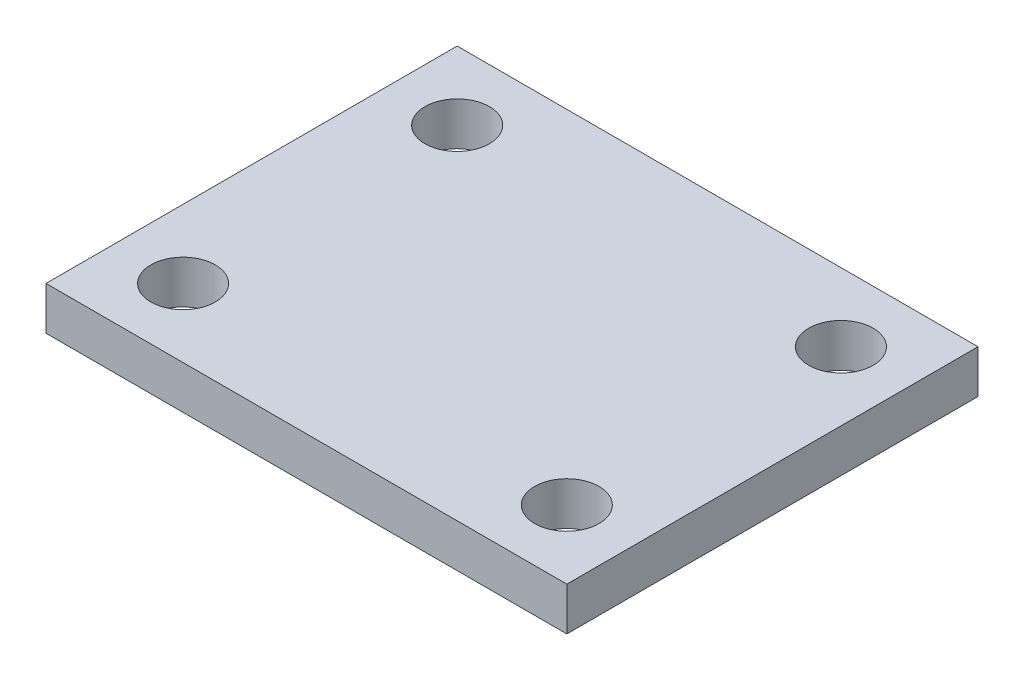
ISO-10303-21;
HEADER;
FILE_DESCRIPTION(('STEP AP214'),'2;1');
FILE_NAME('part.step','',(''),(''),'','','');
FILE_SCHEMA(('AUTOMOTIVE_DESIGN { 1 0 10303 214 1 1 1 1 }'));
ENDSEC;
DATA;
#1=APPLICATION_CONTEXT('core data for automotive mechanical design processes');
#2=APPLICATION_PROTOCOL_DEFINITION('international standard','automotive_design',2000,#1);
#3=PRODUCT_CONTEXT('',#1,'mechanical');
#4=PRODUCT('Part','Part','',(#3));
#5=PRODUCT_RELATED_PRODUCT_CATEGORY('part','',(#4));
#6=PRODUCT_DEFINITION_FORMATION('','',#4);
#7=PRODUCT_DEFINITION_CONTEXT('part definition',#1,'design');
#8=PRODUCT_DEFINITION('design','',#6,#7);
#9=PRODUCT_DEFINITION_SHAPE('','',#8);
#10=(LENGTH_UNIT() NAMED_UNIT(*) SI_UNIT(.MILLI.,.METRE.));
#11=(NAMED_UNIT(*) PLANE_ANGLE_UNIT() SI_UNIT($,.RADIAN.));
#12=(NAMED_UNIT(*) SI_UNIT($,.STERADIAN.) SOLID_ANGLE_UNIT());
#13=UNCERTAINTY_MEASURE_WITH_UNIT(LENGTH_MEASURE(1.E-05),#10,'distance_accuracy_value','');
#14=(GEOMETRIC_REPRESENTATION_CONTEXT(3) GLOBAL_UNCERTAINTY_ASSIGNED_CONTEXT((#13)) GLOBAL_UNIT_ASSIGNED_CONTEXT((#10,
#11,#12)) REPRESENTATION_CONTEXT('',''));
#15=CARTESIAN_POINT('',(0.,0.,0.));
#16=DIRECTION('',(0.,0.,1.));
#17=DIRECTION('',(1.,0.,0.));
#18=AXIS2_PLACEMENT_3D('',#15,#16,#17);
#19=CARTESIAN_POINT('',(0.,1.6,0.));
#20=DIRECTION('',(0.,-1.,0.));
#21=DIRECTION('',(0.,0.,-1.));
#22=AXIS2_PLACEMENT_3D('',#19,#20,#21);
#23=PLANE('',#22);
#24=DIRECTION('',(0.,0.,-1.));
#25=VECTOR('',#24,1.);
#26=CARTESIAN_POINT('',(9.652,1.6,7.62));
#27=LINE('',#26,#25);
#28=CARTESIAN_POINT('',(9.652,1.6,7.62));
#29=VERTEX_POINT('',#28);
#30=CARTESIAN_POINT('',(9.652,1.6,-7.62));
#31=VERTEX_POINT('',#30);
#32=EDGE_CURVE('E92',#29,#31,#27,.T.);
#33=ORIENTED_EDGE('',*,*,#32,.T.);
#34=DIRECTION('',(-1.,0.,0.));
#35=VECTOR('',#34,1.);
#36=CARTESIAN_POINT('',(-9.65199999999999,1.6,-7.62));
#37=LINE('',#36,#35);
#38=CARTESIAN_POINT('',(-9.65199999999999,1.6,-7.62));
#39=VERTEX_POINT('',#38);
#40=EDGE_CURVE('E87',#31,#39,#37,.T.);
#41=ORIENTED_EDGE('',*,*,#40,.T.);
#42=DIRECTION('',(0.,0.,1.));
#43=VECTOR('',#42,1.);
#44=CARTESIAN_POINT('',(-9.65199999999999,1.6,7.62));
#45=LINE('',#44,#43);
#46=CARTESIAN_POINT('',(-9.65199999999999,1.6,7.62));
#47=VERTEX_POINT('',#46);
#48=EDGE_CURVE('E90',#39,#47,#45,.T.);
#49=ORIENTED_EDGE('',*,*,#48,.T.);
#50=DIRECTION('',(1.,0.,0.));
#51=VECTOR('',#50,1.);
#52=CARTESIAN_POINT('',(-9.65199999999999,1.6,7.62));
#53=LINE('',#52,#51);
#54=EDGE_CURVE('E57',#47,#29,#53,.T.);
#55=ORIENTED_EDGE('',*,*,#54,.T.);
#56=EDGE_LOOP('',(#33,#41,#49,#55));
#57=FACE_BOUND('',#56,.T.);
#58=CARTESIAN_POINT('',(7.112,1.6,-5.08));
#59=DIRECTION('',(0.,1.,0.));
#60=DIRECTION('',(0.,0.,1.));
#61=AXIS2_PLACEMENT_3D('',#58,#59,#60);
#62=CIRCLE('',#61,1.1938);
#63=CARTESIAN_POINT('',(7.112,1.6,-3.8862));
#64=VERTEX_POINT('',#63);
#65=EDGE_CURVE('E112',#64,#64,#62,.T.);
#66=ORIENTED_EDGE('',*,*,#65,.F.);
#67=EDGE_LOOP('',(#66));
#68=FACE_BOUND('',#67,.T.);
#69=CARTESIAN_POINT('',(7.112,1.6,5.08));
#70=DIRECTION('',(0.,1.,0.));
#71=DIRECTION('',(0.,0.,1.));
#72=AXIS2_PLACEMENT_3D('',#69,#70,#71);
#73=CIRCLE('',#72,1.1938);
#74=CARTESIAN_POINT('',(7.112,1.6,6.2738));
#75=VERTEX_POINT('',#74);
#76=EDGE_CURVE('E134',#75,#75,#73,.T.);
#77=ORIENTED_EDGE('',*,*,#76,.F.);
#78=EDGE_LOOP('',(#77));
#79=FACE_BOUND('',#78,.T.);
#80=CARTESIAN_POINT('',(-7.112,1.6,5.08));
#81=DIRECTION('',(0.,1.,0.));
#82=DIRECTION('',(0.,0.,1.));
#83=AXIS2_PLACEMENT_3D('',#80,#81,#82);
#84=CIRCLE('',#83,1.1938);
#85=CARTESIAN_POINT('',(-7.112,1.6,6.2738));
#86=VERTEX_POINT('',#85);
#87=EDGE_CURVE('E142',#86,#86,#84,.T.);
#88=ORIENTED_EDGE('',*,*,#87,.F.);
#89=EDGE_LOOP('',(#88));
#90=FACE_BOUND('',#89,.T.);
#91=CARTESIAN_POINT('',(-7.112,1.6,-5.08));
#92=DIRECTION('',(0.,1.,0.));
#93=DIRECTION('',(0.,0.,1.));
#94=AXIS2_PLACEMENT_3D('',#91,#92,#93);
#95=CIRCLE('',#94,1.1938);
#96=CARTESIAN_POINT('',(-7.112,1.6,-3.8862));
#97=VERTEX_POINT('',#96);
#98=EDGE_CURVE('E150',#97,#97,#95,.T.);
#99=ORIENTED_EDGE('',*,*,#98,.F.);
#100=EDGE_LOOP('',(#99));
#101=FACE_BOUND('',#100,.T.);
#102=ADVANCED_FACE('F39',(#57,#68,#79,#90,#101),#23,.F.);
#103=CARTESIAN_POINT('',(0.,0.,0.));
#104=DIRECTION('',(0.,-1.,0.));
#105=DIRECTION('',(0.,0.,-1.));
#106=AXIS2_PLACEMENT_3D('',#103,#104,#105);
#107=PLANE('',#106);
#108=CARTESIAN_POINT('',(-7.112,0.,5.08));
#109=DIRECTION('',(0.,1.,0.));
#110=DIRECTION('',(0.,0.,1.));
#111=AXIS2_PLACEMENT_3D('',#108,#109,#110);
#112=CIRCLE('',#111,1.1938);
#113=CARTESIAN_POINT('',(-7.112,0.,6.2738));
#114=VERTEX_POINT('',#113);
#115=EDGE_CURVE('E146',#114,#114,#112,.T.);
#116=ORIENTED_EDGE('',*,*,#115,.T.);
#117=EDGE_LOOP('',(#116));
#118=FACE_BOUND('',#117,.T.);
#119=CARTESIAN_POINT('',(7.112,0.,-5.08));
#120=DIRECTION('',(0.,1.,0.));
#121=DIRECTION('',(0.,0.,1.));
#122=AXIS2_PLACEMENT_3D('',#119,#120,#121);
#123=CIRCLE('',#122,1.1938);
#124=CARTESIAN_POINT('',(7.112,0.,-3.8862));
#125=VERTEX_POINT('',#124);
#126=EDGE_CURVE('E130',#125,#125,#123,.T.);
#127=ORIENTED_EDGE('',*,*,#126,.T.);
#128=EDGE_LOOP('',(#127));
#129=FACE_BOUND('',#128,.T.);
#130=DIRECTION('',(0.,0.,-1.));
#131=VECTOR('',#130,1.);
#132=CARTESIAN_POINT('',(9.652,0.,7.62));
#133=LINE('',#132,#131);
#134=CARTESIAN_POINT('',(9.652,0.,7.62));
#135=VERTEX_POINT('',#134);
#136=CARTESIAN_POINT('',(9.652,0.,-7.62));
#137=VERTEX_POINT('',#136);
#138=EDGE_CURVE('E108',#135,#137,#133,.T.);
#139=ORIENTED_EDGE('',*,*,#138,.F.);
#140=DIRECTION('',(1.,0.,0.));
#141=VECTOR('',#140,1.);
#142=CARTESIAN_POINT('',(-9.65199999999999,0.,7.62));
#143=LINE('',#142,#141);
#144=CARTESIAN_POINT('',(-9.65199999999999,0.,7.62));
#145=VERTEX_POINT('',#144);
#146=EDGE_CURVE('E80',#145,#135,#143,.T.);
#147=ORIENTED_EDGE('',*,*,#146,.F.);
#148=DIRECTION('',(0.,0.,1.));
#149=VECTOR('',#148,1.);
#150=CARTESIAN_POINT('',(-9.65199999999999,0.,7.62));
#151=LINE('',#150,#149);
#152=CARTESIAN_POINT('',(-9.65199999999999,0.,-7.62));
#153=VERTEX_POINT('',#152);
#154=EDGE_CURVE('E74',#153,#145,#151,.T.);
#155=ORIENTED_EDGE('',*,*,#154,.F.);
#156=DIRECTION('',(-1.,0.,0.));
#157=VECTOR('',#156,1.);
#158=CARTESIAN_POINT('',(-9.65199999999999,0.,-7.62));
#159=LINE('',#158,#157);
#160=EDGE_CURVE('E97',#137,#153,#159,.T.);
#161=ORIENTED_EDGE('',*,*,#160,.F.);
#162=EDGE_LOOP('',(#139,#147,#155,#161));
#163=FACE_BOUND('',#162,.T.);
#164=CARTESIAN_POINT('',(7.112,0.,5.08));
#165=DIRECTION('',(0.,1.,0.));
#166=DIRECTION('',(0.,0.,1.));
#167=AXIS2_PLACEMENT_3D('',#164,#165,#166);
#168=CIRCLE('',#167,1.1938);
#169=CARTESIAN_POINT('',(7.112,0.,6.2738));
#170=VERTEX_POINT('',#169);
#171=EDGE_CURVE('E138',#170,#170,#168,.T.);
#172=ORIENTED_EDGE('',*,*,#171,.T.);
#173=EDGE_LOOP('',(#172));
#174=FACE_BOUND('',#173,.T.);
#175=CARTESIAN_POINT('',(-7.112,0.,-5.08));
#176=DIRECTION('',(0.,1.,0.));
#177=DIRECTION('',(0.,0.,1.));
#178=AXIS2_PLACEMENT_3D('',#175,#176,#177);
#179=CIRCLE('',#178,1.1938);
#180=CARTESIAN_POINT('',(-7.112,0.,-3.8862));
#181=VERTEX_POINT('',#180);
#182=EDGE_CURVE('E154',#181,#181,#179,.T.);
#183=ORIENTED_EDGE('',*,*,#182,.T.);
#184=EDGE_LOOP('',(#183));
#185=FACE_BOUND('',#184,.T.);
#186=ADVANCED_FACE('F125',(#118,#129,#163,#174,#185),#107,.T.);
#187=CARTESIAN_POINT('',(9.652,1.6,7.62));
#188=DIRECTION('',(-1.,0.,0.));
#189=DIRECTION('',(0.,0.,1.));
#190=AXIS2_PLACEMENT_3D('',#187,#188,#189);
#191=PLANE('',#190);
#192=ORIENTED_EDGE('',*,*,#138,.T.);
#193=DIRECTION('',(0.,-1.,0.));
#194=VECTOR('',#193,1.);
#195=CARTESIAN_POINT('',(9.652,1.6,-7.62));
#196=LINE('',#195,#194);
#197=EDGE_CURVE('E11',#31,#137,#196,.T.);
#198=ORIENTED_EDGE('',*,*,#197,.F.);
#199=ORIENTED_EDGE('',*,*,#32,.F.);
#200=DIRECTION('',(0.,-1.,0.));
#201=VECTOR('',#200,1.);
#202=CARTESIAN_POINT('',(9.652,1.6,7.62));
#203=LINE('',#202,#201);
#204=EDGE_CURVE('E104',#29,#135,#203,.T.);
#205=ORIENTED_EDGE('',*,*,#204,.T.);
#206=EDGE_LOOP('',(#192,#198,#199,#205));
#207=FACE_BOUND('',#206,.T.);
#208=ADVANCED_FACE('F41',(#207),#191,.F.);
#209=CARTESIAN_POINT('',(-9.65199999999999,1.6,-7.62));
#210=DIRECTION('',(0.,0.,1.));
#211=DIRECTION('',(1.,0.,0.));
#212=AXIS2_PLACEMENT_3D('',#209,#210,#211);
#213=PLANE('',#212);
#214=ORIENTED_EDGE('',*,*,#160,.T.);
#215=DIRECTION('',(0.,-1.,0.));
#216=VECTOR('',#215,1.);
#217=CARTESIAN_POINT('',(-9.65199999999999,1.6,-7.62));
#218=LINE('',#217,#216);
#219=EDGE_CURVE('E49',#39,#153,#218,.T.);
#220=ORIENTED_EDGE('',*,*,#219,.F.);
#221=ORIENTED_EDGE('',*,*,#40,.F.);
#222=ORIENTED_EDGE('',*,*,#197,.T.);
#223=EDGE_LOOP('',(#214,#220,#221,#222));
#224=FACE_BOUND('',#223,.T.);
#225=ADVANCED_FACE('F96',(#224),#213,.F.);
#226=CARTESIAN_POINT('',(-9.65199999999999,1.6,7.62));
#227=DIRECTION('',(1.,0.,0.));
#228=DIRECTION('',(0.,0.,-1.));
#229=AXIS2_PLACEMENT_3D('',#226,#227,#228);
#230=PLANE('',#229);
#231=ORIENTED_EDGE('',*,*,#154,.T.);
#232=DIRECTION('',(0.,-1.,0.));
#233=VECTOR('',#232,1.);
#234=CARTESIAN_POINT('',(-9.65199999999999,1.6,7.62));
#235=LINE('',#234,#233);
#236=EDGE_CURVE('E99',#47,#145,#235,.T.);
#237=ORIENTED_EDGE('',*,*,#236,.F.);
#238=ORIENTED_EDGE('',*,*,#48,.F.);
#239=ORIENTED_EDGE('',*,*,#219,.T.);
#240=EDGE_LOOP('',(#231,#237,#238,#239));
#241=FACE_BOUND('',#240,.T.);
#242=ADVANCED_FACE('F100',(#241),#230,.F.);
#243=CARTESIAN_POINT('',(-9.65199999999999,1.6,7.62));
#244=DIRECTION('',(0.,0.,-1.));
#245=DIRECTION('',(-1.,0.,0.));
#246=AXIS2_PLACEMENT_3D('',#243,#244,#245);
#247=PLANE('',#246);
#248=ORIENTED_EDGE('',*,*,#146,.T.);
#249=ORIENTED_EDGE('',*,*,#204,.F.);
#250=ORIENTED_EDGE('',*,*,#54,.F.);
#251=ORIENTED_EDGE('',*,*,#236,.T.);
#252=EDGE_LOOP('',(#248,#249,#250,#251));
#253=FACE_BOUND('',#252,.T.);
#254=ADVANCED_FACE('F122',(#253),#247,.F.);
#255=CARTESIAN_POINT('',(7.112,1.6,-5.08));
#256=DIRECTION('',(0.,-1.,0.));
#257=DIRECTION('',(0.,0.,-1.));
#258=AXIS2_PLACEMENT_3D('',#255,#256,#257);
#259=CYLINDRICAL_SURFACE('',#258,1.1938);
#260=ORIENTED_EDGE('',*,*,#65,.T.);
#261=EDGE_LOOP('',(#260));
#262=FACE_BOUND('',#261,.T.);
#263=ORIENTED_EDGE('',*,*,#126,.F.);
#264=EDGE_LOOP('',(#263));
#265=FACE_BOUND('',#264,.T.);
#266=ADVANCED_FACE('F173',(#262,#265),#259,.F.);
#267=CARTESIAN_POINT('',(7.112,1.6,5.08));
#268=DIRECTION('',(0.,-1.,0.));
#269=DIRECTION('',(0.,0.,-1.));
#270=AXIS2_PLACEMENT_3D('',#267,#268,#269);
#271=CYLINDRICAL_SURFACE('',#270,1.1938);
#272=ORIENTED_EDGE('',*,*,#76,.T.);
#273=EDGE_LOOP('',(#272));
#274=FACE_BOUND('',#273,.T.);
#275=ORIENTED_EDGE('',*,*,#171,.F.);
#276=EDGE_LOOP('',(#275));
#277=FACE_BOUND('',#276,.T.);
#278=ADVANCED_FACE('F219',(#274,#277),#271,.F.);
#279=CARTESIAN_POINT('',(-7.112,1.6,5.08));
#280=DIRECTION('',(0.,-1.,0.));
#281=DIRECTION('',(0.,0.,-1.));
#282=AXIS2_PLACEMENT_3D('',#279,#280,#281);
#283=CYLINDRICAL_SURFACE('',#282,1.1938);
#284=ORIENTED_EDGE('',*,*,#87,.T.);
#285=EDGE_LOOP('',(#284));
#286=FACE_BOUND('',#285,.T.);
#287=ORIENTED_EDGE('',*,*,#115,.F.);
#288=EDGE_LOOP('',(#287));
#289=FACE_BOUND('',#288,.T.);
#290=ADVANCED_FACE('F227',(#286,#289),#283,.F.);
#291=CARTESIAN_POINT('',(-7.112,1.6,-5.08));
#292=DIRECTION('',(0.,-1.,0.));
#293=DIRECTION('',(0.,0.,-1.));
#294=AXIS2_PLACEMENT_3D('',#291,#292,#293);
#295=CYLINDRICAL_SURFACE('',#294,1.1938);
#296=ORIENTED_EDGE('',*,*,#98,.T.);
#297=EDGE_LOOP('',(#296));
#298=FACE_BOUND('',#297,.T.);
#299=ORIENTED_EDGE('',*,*,#182,.F.);
#300=EDGE_LOOP('',(#299));
#301=FACE_BOUND('',#300,.T.);
#302=ADVANCED_FACE('F162',(#298,#301),#295,.F.);
#303=CLOSED_SHELL('',(#102,#186,#208,#225,#242,#254,#266,#278,#290,#302));
#304=MANIFOLD_SOLID_BREP('B2',#303);
#305=ADVANCED_BREP_SHAPE_REPRESENTATION('',(#18,#304),#14);
#306=SHAPE_DEFINITION_REPRESENTATION(#9,#305);
ENDSEC;
END-ISO-10303-21;
